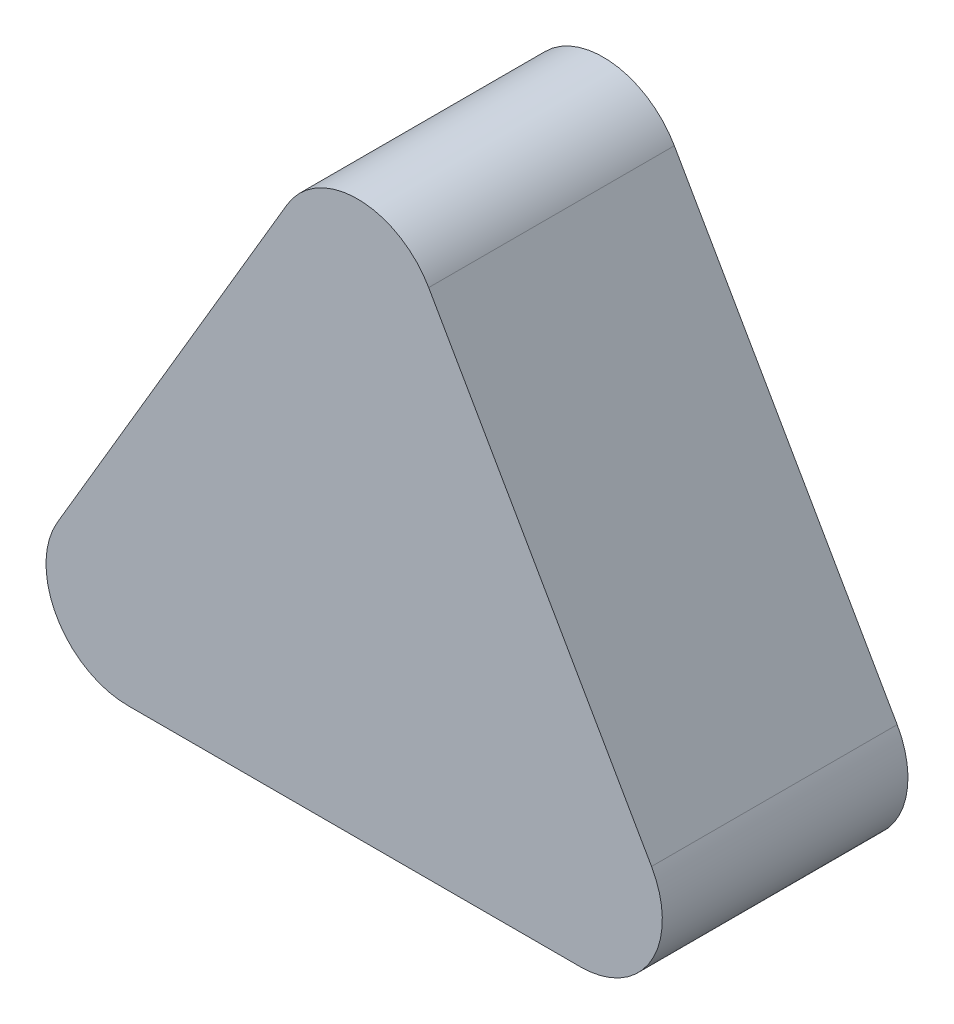
ISO-10303-21;
HEADER;
FILE_DESCRIPTION(('STEP AP214'),'2;1');
FILE_NAME('part.step','',(''),(''),'','','');
FILE_SCHEMA(('AUTOMOTIVE_DESIGN { 1 0 10303 214 1 1 1 1 }'));
ENDSEC;
DATA;
#1=APPLICATION_CONTEXT('core data for automotive mechanical design processes');
#2=APPLICATION_PROTOCOL_DEFINITION('international standard','automotive_design',2000,#1);
#3=PRODUCT_CONTEXT('',#1,'mechanical');
#4=PRODUCT('Part','Part','',(#3));
#5=PRODUCT_RELATED_PRODUCT_CATEGORY('part','',(#4));
#6=PRODUCT_DEFINITION_FORMATION('','',#4);
#7=PRODUCT_DEFINITION_CONTEXT('part definition',#1,'design');
#8=PRODUCT_DEFINITION('design','',#6,#7);
#9=PRODUCT_DEFINITION_SHAPE('','',#8);
#10=(LENGTH_UNIT() NAMED_UNIT(*) SI_UNIT(.MILLI.,.METRE.));
#11=(NAMED_UNIT(*) PLANE_ANGLE_UNIT() SI_UNIT($,.RADIAN.));
#12=(NAMED_UNIT(*) SI_UNIT($,.STERADIAN.) SOLID_ANGLE_UNIT());
#13=UNCERTAINTY_MEASURE_WITH_UNIT(LENGTH_MEASURE(1.E-05),#10,'distance_accuracy_value','');
#14=(GEOMETRIC_REPRESENTATION_CONTEXT(3) GLOBAL_UNCERTAINTY_ASSIGNED_CONTEXT((#13)) GLOBAL_UNIT_ASSIGNED_CONTEXT((#10,
#11,#12)) REPRESENTATION_CONTEXT('',''));
#15=CARTESIAN_POINT('',(0.,0.,0.));
#16=DIRECTION('',(0.,0.,1.));
#17=DIRECTION('',(1.,0.,0.));
#18=AXIS2_PLACEMENT_3D('',#15,#16,#17);
#19=CARTESIAN_POINT('',(0.,0.,60.));
#20=DIRECTION('',(-0.868216398748419,-0.496185736337035,0.));
#21=DIRECTION('',(0.496185736337035,-0.868216398748419,0.));
#22=AXIS2_PLACEMENT_3D('',#19,#20,#21);
#23=PLANE('',#22);
#24=DIRECTION('',(-0.496185736337035,0.868216398748419,0.));
#25=VECTOR('',#24,1.);
#26=CARTESIAN_POINT('',(0.,0.,60.));
#27=LINE('',#26,#25);
#28=CARTESIAN_POINT('',(-17.1014051877285,29.9237147267407,60.));
#29=VERTEX_POINT('',#28);
#30=CARTESIAN_POINT('',(-71.5306973922286,125.163058793894,60.));
#31=VERTEX_POINT('',#30);
#32=EDGE_CURVE('E108',#29,#31,#27,.T.);
#33=ORIENTED_EDGE('',*,*,#32,.F.);
#34=DIRECTION('',(0.,0.,-1.));
#35=VECTOR('',#34,1.);
#36=CARTESIAN_POINT('',(-17.1014051877285,29.9237147267407,60.));
#37=LINE('',#36,#35);
#38=CARTESIAN_POINT('',(-17.1014051877285,29.9237147267407,0.));
#39=VERTEX_POINT('',#38);
#40=EDGE_CURVE('E94',#29,#39,#37,.T.);
#41=ORIENTED_EDGE('',*,*,#40,.T.);
#42=DIRECTION('',(-0.496185736337035,0.868216398748419,0.));
#43=VECTOR('',#42,1.);
#44=CARTESIAN_POINT('',(0.,0.,0.));
#45=LINE('',#44,#43);
#46=CARTESIAN_POINT('',(-71.5306973922286,125.163058793894,0.));
#47=VERTEX_POINT('',#46);
#48=EDGE_CURVE('E106',#39,#47,#45,.T.);
#49=ORIENTED_EDGE('',*,*,#48,.T.);
#50=DIRECTION('',(0.,0.,-1.));
#51=VECTOR('',#50,1.);
#52=CARTESIAN_POINT('',(-71.5306973922286,125.163058793894,60.));
#53=LINE('',#52,#51);
#54=EDGE_CURVE('E110',#47,#31,#53,.F.);
#55=ORIENTED_EDGE('',*,*,#54,.T.);
#56=EDGE_LOOP('',(#33,#41,#49,#55));
#57=FACE_BOUND('',#56,.T.);
#58=ADVANCED_FACE('F36',(#57),#23,.F.);
#59=CARTESIAN_POINT('',(-88.6321025799571,155.086773520634,60.));
#60=DIRECTION('',(0.861593186225746,-0.507599430111349,0.));
#61=DIRECTION('',(0.507599430111349,0.861593186225746,0.));
#62=AXIS2_PLACEMENT_3D('',#59,#60,#61);
#63=PLANE('',#62);
#64=DIRECTION('',(-0.507599430111349,-0.861593186225746,0.));
#65=VECTOR('',#64,1.);
#66=CARTESIAN_POINT('',(-88.6321025799571,155.086773520634,60.));
#67=LINE('',#66,#65);
#68=CARTESIAN_POINT('',(-106.126889091712,125.39133266938,60.));
#69=VERTEX_POINT('',#68);
#70=CARTESIAN_POINT('',(-162.236242723484,30.151988602227,60.));
#71=VERTEX_POINT('',#70);
#72=EDGE_CURVE('E139',#69,#71,#67,.T.);
#73=ORIENTED_EDGE('',*,*,#72,.F.);
#74=DIRECTION('',(0.,0.,-1.));
#75=VECTOR('',#74,1.);
#76=CARTESIAN_POINT('',(-106.126889091712,125.39133266938,60.));
#77=LINE('',#76,#75);
#78=CARTESIAN_POINT('',(-106.126889091712,125.39133266938,0.));
#79=VERTEX_POINT('',#78);
#80=EDGE_CURVE('E11',#69,#79,#77,.T.);
#81=ORIENTED_EDGE('',*,*,#80,.T.);
#82=DIRECTION('',(-0.507599430111349,-0.861593186225746,0.));
#83=VECTOR('',#82,1.);
#84=CARTESIAN_POINT('',(-88.6321025799571,155.086773520634,0.));
#85=LINE('',#84,#83);
#86=CARTESIAN_POINT('',(-162.236242723484,30.151988602227,0.));
#87=VERTEX_POINT('',#86);
#88=EDGE_CURVE('E114',#79,#87,#85,.T.);
#89=ORIENTED_EDGE('',*,*,#88,.T.);
#90=DIRECTION('',(0.,0.,-1.));
#91=VECTOR('',#90,1.);
#92=CARTESIAN_POINT('',(-162.236242723484,30.151988602227,60.));
#93=LINE('',#92,#91);
#94=EDGE_CURVE('E44',#87,#71,#93,.F.);
#95=ORIENTED_EDGE('',*,*,#94,.T.);
#96=EDGE_LOOP('',(#73,#81,#89,#95));
#97=FACE_BOUND('',#96,.T.);
#98=ADVANCED_FACE('F144',(#97),#63,.F.);
#99=CARTESIAN_POINT('',(-180.,0.,60.));
#100=DIRECTION('',(0.,1.,0.));
#101=DIRECTION('',(0.,0.,1.));
#102=AXIS2_PLACEMENT_3D('',#99,#100,#101);
#103=PLANE('',#102);
#104=DIRECTION('',(1.,0.,0.));
#105=VECTOR('',#104,1.);
#106=CARTESIAN_POINT('',(-180.,0.,0.));
#107=LINE('',#106,#105);
#108=CARTESIAN_POINT('',(-145.004378998969,0.,0.));
#109=VERTEX_POINT('',#108);
#110=CARTESIAN_POINT('',(-34.465733162697,0.,0.));
#111=VERTEX_POINT('',#110);
#112=EDGE_CURVE('E116',#109,#111,#107,.T.);
#113=ORIENTED_EDGE('',*,*,#112,.T.);
#114=DIRECTION('',(0.,0.,-1.));
#115=VECTOR('',#114,1.);
#116=CARTESIAN_POINT('',(-34.4657331626969,0.,60.));
#117=LINE('',#116,#115);
#118=CARTESIAN_POINT('',(-34.465733162697,0.,60.));
#119=VERTEX_POINT('',#118);
#120=EDGE_CURVE('E95',#111,#119,#117,.F.);
#121=ORIENTED_EDGE('',*,*,#120,.T.);
#122=DIRECTION('',(1.,0.,0.));
#123=VECTOR('',#122,1.);
#124=CARTESIAN_POINT('',(-180.,0.,60.));
#125=LINE('',#124,#123);
#126=CARTESIAN_POINT('',(-145.004378998969,0.,60.));
#127=VERTEX_POINT('',#126);
#128=EDGE_CURVE('E119',#127,#119,#125,.T.);
#129=ORIENTED_EDGE('',*,*,#128,.F.);
#130=DIRECTION('',(0.,0.,-1.));
#131=VECTOR('',#130,1.);
#132=CARTESIAN_POINT('',(-145.004378998969,0.,60.));
#133=LINE('',#132,#131);
#134=EDGE_CURVE('E100',#127,#109,#133,.T.);
#135=ORIENTED_EDGE('',*,*,#134,.T.);
#136=EDGE_LOOP('',(#113,#121,#129,#135));
#137=FACE_BOUND('',#136,.T.);
#138=ADVANCED_FACE('F143',(#137),#103,.F.);
#139=CARTESIAN_POINT('',(0.,0.,60.));
#140=DIRECTION('',(0.,0.,1.));
#141=DIRECTION('',(1.,0.,0.));
#142=AXIS2_PLACEMENT_3D('',#139,#140,#141);
#143=PLANE('',#142);
#144=ORIENTED_EDGE('',*,*,#128,.T.);
#145=CARTESIAN_POINT('',(-34.4657331626969,20.,60.));
#146=DIRECTION('',(0.,0.,1.));
#147=DIRECTION('',(1.,0.,0.));
#148=AXIS2_PLACEMENT_3D('',#145,#146,#147);
#149=CIRCLE('',#148,20.);
#150=EDGE_CURVE('E132',#119,#29,#149,.T.);
#151=ORIENTED_EDGE('',*,*,#150,.T.);
#152=ORIENTED_EDGE('',*,*,#32,.T.);
#153=CARTESIAN_POINT('',(-88.895025367197,115.239344067153,60.));
#154=DIRECTION('',(0.,0.,1.));
#155=DIRECTION('',(1.,0.,0.));
#156=AXIS2_PLACEMENT_3D('',#153,#154,#155);
#157=CIRCLE('',#156,20.);
#158=EDGE_CURVE('E57',#31,#69,#157,.T.);
#159=ORIENTED_EDGE('',*,*,#158,.T.);
#160=ORIENTED_EDGE('',*,*,#72,.T.);
#161=CARTESIAN_POINT('',(-145.004378998969,20.,60.));
#162=DIRECTION('',(0.,0.,1.));
#163=DIRECTION('',(1.,0.,0.));
#164=AXIS2_PLACEMENT_3D('',#161,#162,#163);
#165=CIRCLE('',#164,20.);
#166=EDGE_CURVE('E129',#71,#127,#165,.T.);
#167=ORIENTED_EDGE('',*,*,#166,.T.);
#168=EDGE_LOOP('',(#144,#151,#152,#159,#160,#167));
#169=FACE_BOUND('',#168,.T.);
#170=ADVANCED_FACE('F134',(#169),#143,.T.);
#171=CARTESIAN_POINT('',(0.,0.,0.));
#172=DIRECTION('',(0.,0.,1.));
#173=DIRECTION('',(1.,0.,0.));
#174=AXIS2_PLACEMENT_3D('',#171,#172,#173);
#175=PLANE('',#174);
#176=ORIENTED_EDGE('',*,*,#48,.F.);
#177=CARTESIAN_POINT('',(-34.4657331626969,20.,0.));
#178=DIRECTION('',(0.,0.,1.));
#179=DIRECTION('',(1.,0.,0.));
#180=AXIS2_PLACEMENT_3D('',#177,#178,#179);
#181=CIRCLE('',#180,20.);
#182=EDGE_CURVE('E90',#39,#111,#181,.F.);
#183=ORIENTED_EDGE('',*,*,#182,.T.);
#184=ORIENTED_EDGE('',*,*,#112,.F.);
#185=CARTESIAN_POINT('',(-145.004378998969,20.,0.));
#186=DIRECTION('',(0.,0.,1.));
#187=DIRECTION('',(1.,0.,0.));
#188=AXIS2_PLACEMENT_3D('',#185,#186,#187);
#189=CIRCLE('',#188,20.);
#190=EDGE_CURVE('E109',#109,#87,#189,.F.);
#191=ORIENTED_EDGE('',*,*,#190,.T.);
#192=ORIENTED_EDGE('',*,*,#88,.F.);
#193=CARTESIAN_POINT('',(-88.895025367197,115.239344067153,0.));
#194=DIRECTION('',(0.,0.,1.));
#195=DIRECTION('',(1.,0.,0.));
#196=AXIS2_PLACEMENT_3D('',#193,#194,#195);
#197=CIRCLE('',#196,20.);
#198=EDGE_CURVE('E101',#79,#47,#197,.F.);
#199=ORIENTED_EDGE('',*,*,#198,.T.);
#200=EDGE_LOOP('',(#176,#183,#184,#191,#192,#199));
#201=FACE_BOUND('',#200,.T.);
#202=ADVANCED_FACE('F112',(#201),#175,.F.);
#203=CARTESIAN_POINT('',(-34.4657331626969,20.,60.));
#204=DIRECTION('',(0.,0.,-1.));
#205=DIRECTION('',(-1.,0.,0.));
#206=AXIS2_PLACEMENT_3D('',#203,#204,#205);
#207=CYLINDRICAL_SURFACE('',#206,20.);
#208=ORIENTED_EDGE('',*,*,#150,.F.);
#209=ORIENTED_EDGE('',*,*,#120,.F.);
#210=ORIENTED_EDGE('',*,*,#182,.F.);
#211=ORIENTED_EDGE('',*,*,#40,.F.);
#212=EDGE_LOOP('',(#208,#209,#210,#211));
#213=FACE_BOUND('',#212,.T.);
#214=ADVANCED_FACE('F93',(#213),#207,.T.);
#215=CARTESIAN_POINT('',(-88.895025367197,115.239344067153,60.));
#216=DIRECTION('',(0.,0.,-1.));
#217=DIRECTION('',(-1.,0.,0.));
#218=AXIS2_PLACEMENT_3D('',#215,#216,#217);
#219=CYLINDRICAL_SURFACE('',#218,20.);
#220=ORIENTED_EDGE('',*,*,#158,.F.);
#221=ORIENTED_EDGE('',*,*,#54,.F.);
#222=ORIENTED_EDGE('',*,*,#198,.F.);
#223=ORIENTED_EDGE('',*,*,#80,.F.);
#224=EDGE_LOOP('',(#220,#221,#222,#223));
#225=FACE_BOUND('',#224,.T.);
#226=ADVANCED_FACE('F146',(#225),#219,.T.);
#227=CARTESIAN_POINT('',(-145.004378998969,20.,60.));
#228=DIRECTION('',(0.,0.,-1.));
#229=DIRECTION('',(-1.,0.,0.));
#230=AXIS2_PLACEMENT_3D('',#227,#228,#229);
#231=CYLINDRICAL_SURFACE('',#230,20.);
#232=ORIENTED_EDGE('',*,*,#166,.F.);
#233=ORIENTED_EDGE('',*,*,#94,.F.);
#234=ORIENTED_EDGE('',*,*,#190,.F.);
#235=ORIENTED_EDGE('',*,*,#134,.F.);
#236=EDGE_LOOP('',(#232,#233,#234,#235));
#237=FACE_BOUND('',#236,.T.);
#238=ADVANCED_FACE('F38',(#237),#231,.T.);
#239=CLOSED_SHELL('',(#58,#98,#138,#170,#202,#214,#226,#238));
#240=MANIFOLD_SOLID_BREP('B2',#239);
#241=ADVANCED_BREP_SHAPE_REPRESENTATION('',(#18,#240),#14);
#242=SHAPE_DEFINITION_REPRESENTATION(#9,#241);
ENDSEC;
END-ISO-10303-21;
